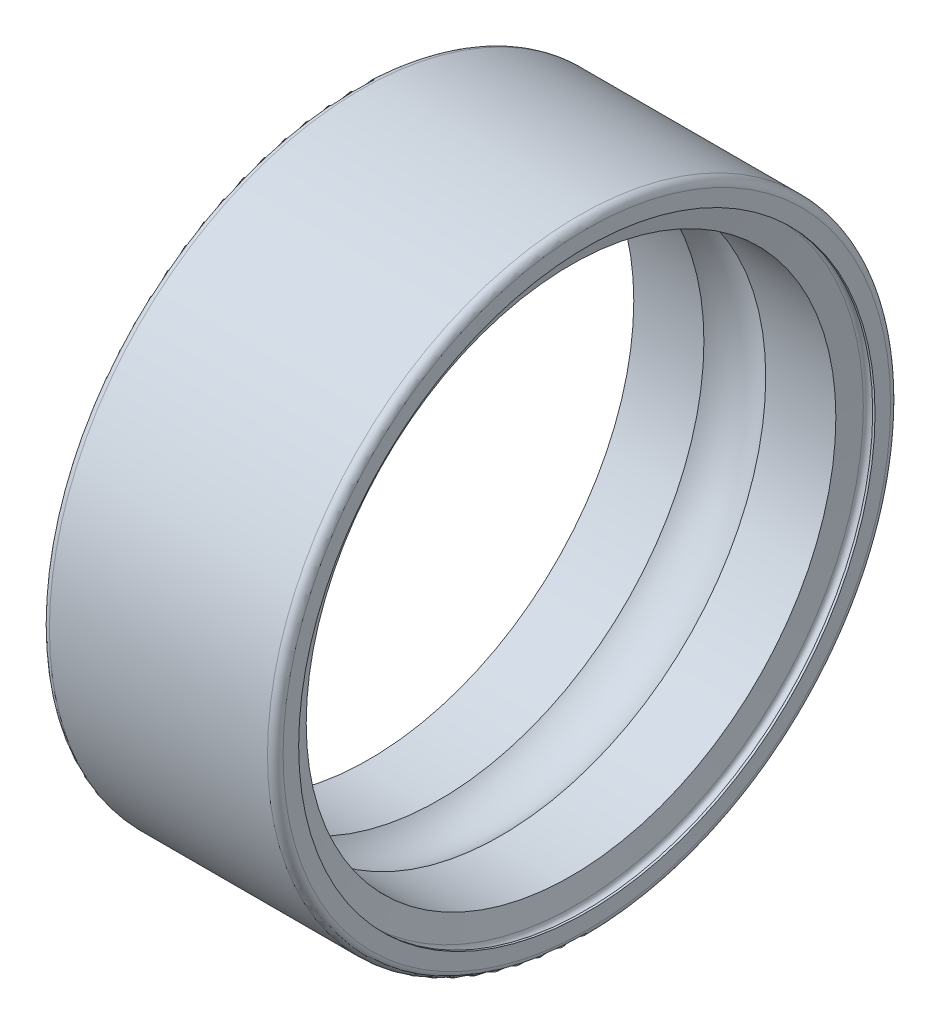
ISO-10303-21;
HEADER;
FILE_DESCRIPTION(('STEP AP214'),'2;1');
FILE_NAME('part.step','',(''),(''),'','','');
FILE_SCHEMA(('AUTOMOTIVE_DESIGN { 1 0 10303 214 1 1 1 1 }'));
ENDSEC;
DATA;
#1=APPLICATION_CONTEXT('core data for automotive mechanical design processes');
#2=APPLICATION_PROTOCOL_DEFINITION('international standard','automotive_design',2000,#1);
#3=PRODUCT_CONTEXT('',#1,'mechanical');
#4=PRODUCT('Part','Part','',(#3));
#5=PRODUCT_RELATED_PRODUCT_CATEGORY('part','',(#4));
#6=PRODUCT_DEFINITION_FORMATION('','',#4);
#7=PRODUCT_DEFINITION_CONTEXT('part definition',#1,'design');
#8=PRODUCT_DEFINITION('design','',#6,#7);
#9=PRODUCT_DEFINITION_SHAPE('','',#8);
#10=(LENGTH_UNIT() NAMED_UNIT(*) SI_UNIT(.MILLI.,.METRE.));
#11=(NAMED_UNIT(*) PLANE_ANGLE_UNIT() SI_UNIT($,.RADIAN.));
#12=(NAMED_UNIT(*) SI_UNIT($,.STERADIAN.) SOLID_ANGLE_UNIT());
#13=UNCERTAINTY_MEASURE_WITH_UNIT(LENGTH_MEASURE(1.E-05),#10,'distance_accuracy_value','');
#14=(GEOMETRIC_REPRESENTATION_CONTEXT(3) GLOBAL_UNCERTAINTY_ASSIGNED_CONTEXT((#13)) GLOBAL_UNIT_ASSIGNED_CONTEXT((#10,
#11,#12)) REPRESENTATION_CONTEXT('',''));
#15=CARTESIAN_POINT('',(0.,0.,0.));
#16=DIRECTION('',(0.,0.,1.));
#17=DIRECTION('',(1.,0.,0.));
#18=AXIS2_PLACEMENT_3D('',#15,#16,#17);
#19=CARTESIAN_POINT('',(0.0999999999999227,0.,0.));
#20=DIRECTION('',(-1.,0.,0.));
#21=DIRECTION('',(0.,0.,1.));
#22=AXIS2_PLACEMENT_3D('',#19,#20,#21);
#23=TOROIDAL_SURFACE('',#22,3.90000000000008,0.0999999999999227);
#24=CARTESIAN_POINT('',(0.,0.,0.));
#25=DIRECTION('',(-1.,0.,0.));
#26=DIRECTION('',(0.,0.,1.));
#27=AXIS2_PLACEMENT_3D('',#24,#25,#26);
#28=CIRCLE('',#27,3.9);
#29=CARTESIAN_POINT('',(0.,0.,3.9));
#30=VERTEX_POINT('',#29);
#31=EDGE_CURVE('E10',#30,#30,#28,.T.);
#32=ORIENTED_EDGE('',*,*,#31,.F.);
#33=EDGE_LOOP('',(#32));
#34=FACE_BOUND('',#33,.T.);
#35=CARTESIAN_POINT('',(0.100000000000003,0.,0.));
#36=DIRECTION('',(-1.,0.,0.));
#37=DIRECTION('',(0.,0.,1.));
#38=AXIS2_PLACEMENT_3D('',#35,#36,#37);
#39=CIRCLE('',#38,4.);
#40=CARTESIAN_POINT('',(0.100000000000003,0.,4.));
#41=VERTEX_POINT('',#40);
#42=EDGE_CURVE('E77',#41,#41,#39,.T.);
#43=ORIENTED_EDGE('',*,*,#42,.T.);
#44=EDGE_LOOP('',(#43));
#45=FACE_BOUND('',#44,.T.);
#46=ADVANCED_FACE('F31',(#34,#45),#23,.T.);
#47=CARTESIAN_POINT('',(0.,3.9,0.));
#48=DIRECTION('',(1.,0.,0.));
#49=DIRECTION('',(0.,0.,-1.));
#50=AXIS2_PLACEMENT_3D('',#47,#48,#49);
#51=PLANE('',#50);
#52=CARTESIAN_POINT('',(0.,0.,0.));
#53=DIRECTION('',(-1.,0.,0.));
#54=DIRECTION('',(0.,0.,1.));
#55=AXIS2_PLACEMENT_3D('',#52,#53,#54);
#56=CIRCLE('',#55,3.7);
#57=CARTESIAN_POINT('',(0.,0.,3.7));
#58=VERTEX_POINT('',#57);
#59=EDGE_CURVE('E37',#58,#58,#56,.T.);
#60=ORIENTED_EDGE('',*,*,#59,.F.);
#61=EDGE_LOOP('',(#60));
#62=FACE_BOUND('',#61,.T.);
#63=ORIENTED_EDGE('',*,*,#31,.T.);
#64=EDGE_LOOP('',(#63));
#65=FACE_BOUND('',#64,.T.);
#66=ADVANCED_FACE('F150',(#62,#65),#51,.F.);
#67=CARTESIAN_POINT('',(50.,0.,0.));
#68=DIRECTION('',(-1.,0.,0.));
#69=DIRECTION('',(0.,0.,1.));
#70=AXIS2_PLACEMENT_3D('',#67,#68,#69);
#71=CYLINDRICAL_SURFACE('',#70,3.7);
#72=CARTESIAN_POINT('',(0.0300000000000022,0.,0.));
#73=DIRECTION('',(-1.,0.,0.));
#74=DIRECTION('',(0.,0.,1.));
#75=AXIS2_PLACEMENT_3D('',#72,#73,#74);
#76=CIRCLE('',#75,3.7);
#77=CARTESIAN_POINT('',(0.0300000000000022,0.,3.7));
#78=VERTEX_POINT('',#77);
#79=EDGE_CURVE('E41',#78,#78,#76,.T.);
#80=ORIENTED_EDGE('',*,*,#79,.F.);
#81=EDGE_LOOP('',(#80));
#82=FACE_BOUND('',#81,.T.);
#83=ORIENTED_EDGE('',*,*,#59,.T.);
#84=EDGE_LOOP('',(#83));
#85=FACE_BOUND('',#84,.T.);
#86=ADVANCED_FACE('F145',(#82,#85),#71,.F.);
#87=CARTESIAN_POINT('',(0.09,0.,0.));
#88=DIRECTION('',(-1.,0.,0.));
#89=DIRECTION('',(0.,0.,1.));
#90=AXIS2_PLACEMENT_3D('',#87,#88,#89);
#91=TOROIDAL_SURFACE('',#90,3.7,0.06);
#92=CARTESIAN_POINT('',(0.149999999999997,0.,0.));
#93=DIRECTION('',(-1.,0.,0.));
#94=DIRECTION('',(0.,0.,1.));
#95=AXIS2_PLACEMENT_3D('',#92,#93,#94);
#96=CIRCLE('',#95,3.7);
#97=CARTESIAN_POINT('',(0.149999999999997,0.,3.7));
#98=VERTEX_POINT('',#97);
#99=EDGE_CURVE('E45',#98,#98,#96,.T.);
#100=ORIENTED_EDGE('',*,*,#99,.F.);
#101=EDGE_LOOP('',(#100));
#102=FACE_BOUND('',#101,.T.);
#103=ORIENTED_EDGE('',*,*,#79,.T.);
#104=EDGE_LOOP('',(#103));
#105=FACE_BOUND('',#104,.T.);
#106=ADVANCED_FACE('F139',(#102,#105),#91,.F.);
#107=CARTESIAN_POINT('',(0.149999999999997,0.,0.));
#108=DIRECTION('',(-1.,0.,0.));
#109=DIRECTION('',(0.,0.,1.));
#110=AXIS2_PLACEMENT_3D('',#107,#108,#109);
#111=CONICAL_SURFACE('',#110,3.7,1.39626340159545);
#112=CARTESIAN_POINT('',(0.202898094212541,0.,0.));
#113=DIRECTION('',(-1.,0.,0.));
#114=DIRECTION('',(0.,0.,1.));
#115=AXIS2_PLACEMENT_3D('',#112,#113,#114);
#116=CIRCLE('',#115,3.4);
#117=CARTESIAN_POINT('',(0.202898094212541,0.,3.4));
#118=VERTEX_POINT('',#117);
#119=EDGE_CURVE('E50',#118,#118,#116,.T.);
#120=ORIENTED_EDGE('',*,*,#119,.F.);
#121=EDGE_LOOP('',(#120));
#122=FACE_BOUND('',#121,.T.);
#123=ORIENTED_EDGE('',*,*,#99,.T.);
#124=EDGE_LOOP('',(#123));
#125=FACE_BOUND('',#124,.T.);
#126=ADVANCED_FACE('F133',(#122,#125),#111,.F.);
#127=CARTESIAN_POINT('',(50.,0.,0.));
#128=DIRECTION('',(-1.,0.,0.));
#129=DIRECTION('',(0.,0.,1.));
#130=AXIS2_PLACEMENT_3D('',#127,#128,#129);
#131=CYLINDRICAL_SURFACE('',#130,3.4);
#132=CARTESIAN_POINT('',(1.1031373033403,0.,0.));
#133=DIRECTION('',(-1.,0.,0.));
#134=DIRECTION('',(0.,0.,1.));
#135=AXIS2_PLACEMENT_3D('',#132,#133,#134);
#136=CIRCLE('',#135,3.4);
#137=CARTESIAN_POINT('',(1.1031373033403,0.,3.4));
#138=VERTEX_POINT('',#137);
#139=EDGE_CURVE('E53',#138,#138,#136,.T.);
#140=ORIENTED_EDGE('',*,*,#139,.F.);
#141=EDGE_LOOP('',(#140));
#142=FACE_BOUND('',#141,.T.);
#143=ORIENTED_EDGE('',*,*,#119,.T.);
#144=EDGE_LOOP('',(#143));
#145=FACE_BOUND('',#144,.T.);
#146=ADVANCED_FACE('F127',(#142,#145),#131,.F.);
#147=CARTESIAN_POINT('',(1.5,0.,0.));
#148=DIRECTION('',(-1.,0.,0.));
#149=DIRECTION('',(0.,0.,1.));
#150=AXIS2_PLACEMENT_3D('',#147,#148,#149);
#151=TOROIDAL_SURFACE('',#150,2.94999999999997,0.600000000000029);
#152=CARTESIAN_POINT('',(1.8968626966597,0.,0.));
#153=DIRECTION('',(-1.,0.,0.));
#154=DIRECTION('',(0.,0.,1.));
#155=AXIS2_PLACEMENT_3D('',#152,#153,#154);
#156=CIRCLE('',#155,3.4);
#157=CARTESIAN_POINT('',(1.8968626966597,0.,3.4));
#158=VERTEX_POINT('',#157);
#159=EDGE_CURVE('E56',#158,#158,#156,.T.);
#160=ORIENTED_EDGE('',*,*,#159,.F.);
#161=EDGE_LOOP('',(#160));
#162=FACE_BOUND('',#161,.T.);
#163=ORIENTED_EDGE('',*,*,#139,.T.);
#164=EDGE_LOOP('',(#163));
#165=FACE_BOUND('',#164,.T.);
#166=ADVANCED_FACE('F121',(#162,#165),#151,.F.);
#167=CARTESIAN_POINT('',(50.,0.,0.));
#168=DIRECTION('',(-1.,0.,0.));
#169=DIRECTION('',(0.,0.,1.));
#170=AXIS2_PLACEMENT_3D('',#167,#168,#169);
#171=CYLINDRICAL_SURFACE('',#170,3.4);
#172=CARTESIAN_POINT('',(2.7971019057875,0.,0.));
#173=DIRECTION('',(-1.,0.,0.));
#174=DIRECTION('',(0.,0.,1.));
#175=AXIS2_PLACEMENT_3D('',#172,#173,#174);
#176=CIRCLE('',#175,3.4);
#177=CARTESIAN_POINT('',(2.7971019057875,0.,3.4));
#178=VERTEX_POINT('',#177);
#179=EDGE_CURVE('E59',#178,#178,#176,.T.);
#180=ORIENTED_EDGE('',*,*,#179,.F.);
#181=EDGE_LOOP('',(#180));
#182=FACE_BOUND('',#181,.T.);
#183=ORIENTED_EDGE('',*,*,#159,.T.);
#184=EDGE_LOOP('',(#183));
#185=FACE_BOUND('',#184,.T.);
#186=ADVANCED_FACE('F115',(#182,#185),#171,.F.);
#187=CARTESIAN_POINT('',(2.7971019057875,0.,0.));
#188=DIRECTION('',(1.,0.,0.));
#189=DIRECTION('',(0.,0.,-1.));
#190=AXIS2_PLACEMENT_3D('',#187,#188,#189);
#191=CONICAL_SURFACE('',#190,3.4,1.39626340159559);
#192=CARTESIAN_POINT('',(2.85,0.,0.));
#193=DIRECTION('',(-1.,0.,0.));
#194=DIRECTION('',(0.,0.,1.));
#195=AXIS2_PLACEMENT_3D('',#192,#193,#194);
#196=CIRCLE('',#195,3.7);
#197=CARTESIAN_POINT('',(2.85,0.,3.7));
#198=VERTEX_POINT('',#197);
#199=EDGE_CURVE('E62',#198,#198,#196,.T.);
#200=ORIENTED_EDGE('',*,*,#199,.F.);
#201=EDGE_LOOP('',(#200));
#202=FACE_BOUND('',#201,.T.);
#203=ORIENTED_EDGE('',*,*,#179,.T.);
#204=EDGE_LOOP('',(#203));
#205=FACE_BOUND('',#204,.T.);
#206=ADVANCED_FACE('F109',(#202,#205),#191,.F.);
#207=CARTESIAN_POINT('',(2.91,0.,0.));
#208=DIRECTION('',(-1.,0.,0.));
#209=DIRECTION('',(0.,0.,1.));
#210=AXIS2_PLACEMENT_3D('',#207,#208,#209);
#211=TOROIDAL_SURFACE('',#210,3.7,0.0599999999999999);
#212=CARTESIAN_POINT('',(2.97,0.,0.));
#213=DIRECTION('',(-1.,0.,0.));
#214=DIRECTION('',(0.,0.,1.));
#215=AXIS2_PLACEMENT_3D('',#212,#213,#214);
#216=CIRCLE('',#215,3.7);
#217=CARTESIAN_POINT('',(2.97,0.,3.7));
#218=VERTEX_POINT('',#217);
#219=EDGE_CURVE('E65',#218,#218,#216,.T.);
#220=ORIENTED_EDGE('',*,*,#219,.F.);
#221=EDGE_LOOP('',(#220));
#222=FACE_BOUND('',#221,.T.);
#223=ORIENTED_EDGE('',*,*,#199,.T.);
#224=EDGE_LOOP('',(#223));
#225=FACE_BOUND('',#224,.T.);
#226=ADVANCED_FACE('F103',(#222,#225),#211,.F.);
#227=CARTESIAN_POINT('',(50.,0.,0.));
#228=DIRECTION('',(-1.,0.,0.));
#229=DIRECTION('',(0.,0.,1.));
#230=AXIS2_PLACEMENT_3D('',#227,#228,#229);
#231=CYLINDRICAL_SURFACE('',#230,3.7);
#232=CARTESIAN_POINT('',(3.,0.,0.));
#233=DIRECTION('',(-1.,0.,0.));
#234=DIRECTION('',(0.,0.,1.));
#235=AXIS2_PLACEMENT_3D('',#232,#233,#234);
#236=CIRCLE('',#235,3.7);
#237=CARTESIAN_POINT('',(3.,0.,3.7));
#238=VERTEX_POINT('',#237);
#239=EDGE_CURVE('E68',#238,#238,#236,.T.);
#240=ORIENTED_EDGE('',*,*,#239,.F.);
#241=EDGE_LOOP('',(#240));
#242=FACE_BOUND('',#241,.T.);
#243=ORIENTED_EDGE('',*,*,#219,.T.);
#244=EDGE_LOOP('',(#243));
#245=FACE_BOUND('',#244,.T.);
#246=ADVANCED_FACE('F97',(#242,#245),#231,.F.);
#247=CARTESIAN_POINT('',(3.,3.7,0.));
#248=DIRECTION('',(-1.,0.,0.));
#249=DIRECTION('',(0.,0.,1.));
#250=AXIS2_PLACEMENT_3D('',#247,#248,#249);
#251=PLANE('',#250);
#252=CARTESIAN_POINT('',(3.,0.,0.));
#253=DIRECTION('',(-1.,0.,0.));
#254=DIRECTION('',(0.,0.,1.));
#255=AXIS2_PLACEMENT_3D('',#252,#253,#254);
#256=CIRCLE('',#255,3.9);
#257=CARTESIAN_POINT('',(3.,0.,3.9));
#258=VERTEX_POINT('',#257);
#259=EDGE_CURVE('E71',#258,#258,#256,.T.);
#260=ORIENTED_EDGE('',*,*,#259,.F.);
#261=EDGE_LOOP('',(#260));
#262=FACE_BOUND('',#261,.T.);
#263=ORIENTED_EDGE('',*,*,#239,.T.);
#264=EDGE_LOOP('',(#263));
#265=FACE_BOUND('',#264,.T.);
#266=ADVANCED_FACE('F91',(#262,#265),#251,.F.);
#267=CARTESIAN_POINT('',(2.90000000000015,0.,0.));
#268=DIRECTION('',(-1.,0.,0.));
#269=DIRECTION('',(0.,0.,1.));
#270=AXIS2_PLACEMENT_3D('',#267,#268,#269);
#271=TOROIDAL_SURFACE('',#270,3.90000000000015,0.0999999999998459);
#272=CARTESIAN_POINT('',(2.9,0.,0.));
#273=DIRECTION('',(-1.,0.,0.));
#274=DIRECTION('',(0.,0.,1.));
#275=AXIS2_PLACEMENT_3D('',#272,#273,#274);
#276=CIRCLE('',#275,4.);
#277=CARTESIAN_POINT('',(2.9,0.,4.));
#278=VERTEX_POINT('',#277);
#279=EDGE_CURVE('E74',#278,#278,#276,.T.);
#280=ORIENTED_EDGE('',*,*,#279,.F.);
#281=EDGE_LOOP('',(#280));
#282=FACE_BOUND('',#281,.T.);
#283=ORIENTED_EDGE('',*,*,#259,.T.);
#284=EDGE_LOOP('',(#283));
#285=FACE_BOUND('',#284,.T.);
#286=ADVANCED_FACE('F85',(#282,#285),#271,.T.);
#287=CARTESIAN_POINT('',(50.,0.,0.));
#288=DIRECTION('',(-1.,0.,0.));
#289=DIRECTION('',(0.,0.,1.));
#290=AXIS2_PLACEMENT_3D('',#287,#288,#289);
#291=CYLINDRICAL_SURFACE('',#290,4.);
#292=ORIENTED_EDGE('',*,*,#42,.F.);
#293=EDGE_LOOP('',(#292));
#294=FACE_BOUND('',#293,.T.);
#295=ORIENTED_EDGE('',*,*,#279,.T.);
#296=EDGE_LOOP('',(#295));
#297=FACE_BOUND('',#296,.T.);
#298=ADVANCED_FACE('F82',(#294,#297),#291,.T.);
#299=CLOSED_SHELL('',(#46,#66,#86,#106,#126,#146,#166,#186,#206,#226,#246,#266,#286,#298));
#300=MANIFOLD_SOLID_BREP('B2',#299);
#301=ADVANCED_BREP_SHAPE_REPRESENTATION('',(#18,#300),#14);
#302=SHAPE_DEFINITION_REPRESENTATION(#9,#301);
ENDSEC;
END-ISO-10303-21;
